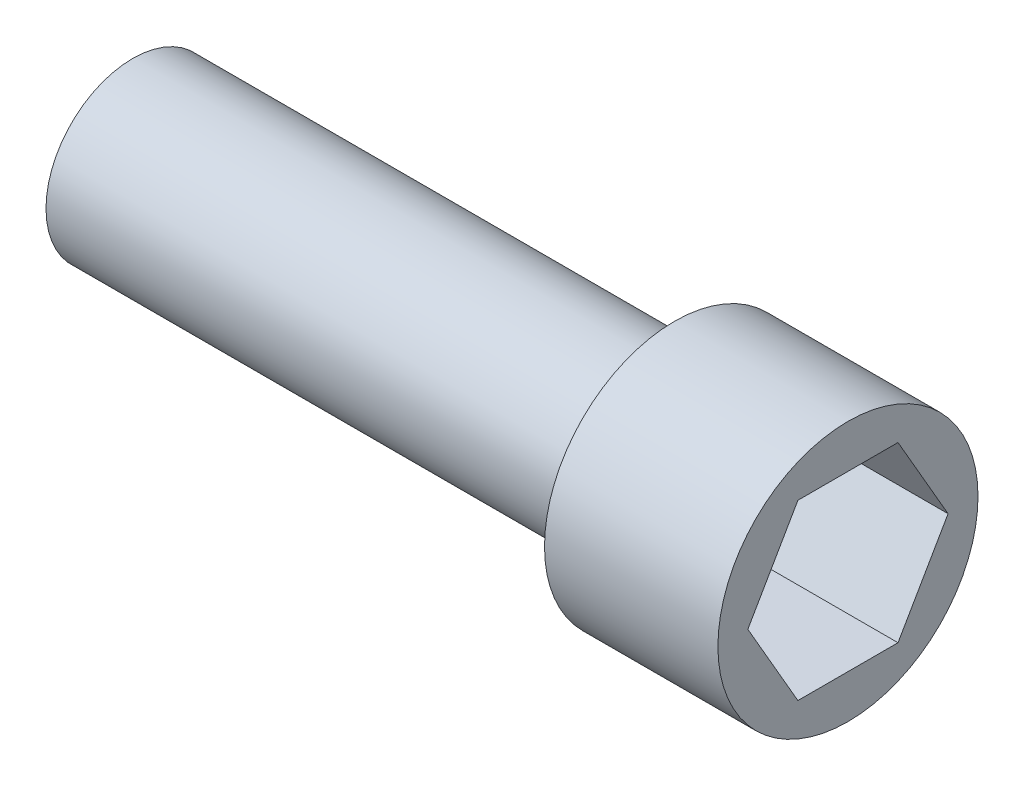
ISO-10303-21;
HEADER;
FILE_DESCRIPTION(('STEP AP214'),'2;1');
FILE_NAME('part.step','',(''),(''),'','','');
FILE_SCHEMA(('AUTOMOTIVE_DESIGN { 1 0 10303 214 1 1 1 1 }'));
ENDSEC;
DATA;
#1=APPLICATION_CONTEXT('core data for automotive mechanical design processes');
#2=APPLICATION_PROTOCOL_DEFINITION('international standard','automotive_design',2000,#1);
#3=PRODUCT_CONTEXT('',#1,'mechanical');
#4=PRODUCT('Part','Part','',(#3));
#5=PRODUCT_RELATED_PRODUCT_CATEGORY('part','',(#4));
#6=PRODUCT_DEFINITION_FORMATION('','',#4);
#7=PRODUCT_DEFINITION_CONTEXT('part definition',#1,'design');
#8=PRODUCT_DEFINITION('design','',#6,#7);
#9=PRODUCT_DEFINITION_SHAPE('','',#8);
#10=(LENGTH_UNIT() NAMED_UNIT(*) SI_UNIT(.MILLI.,.METRE.));
#11=(NAMED_UNIT(*) PLANE_ANGLE_UNIT() SI_UNIT($,.RADIAN.));
#12=(NAMED_UNIT(*) SI_UNIT($,.STERADIAN.) SOLID_ANGLE_UNIT());
#13=UNCERTAINTY_MEASURE_WITH_UNIT(LENGTH_MEASURE(1.E-05),#10,'distance_accuracy_value','');
#14=(GEOMETRIC_REPRESENTATION_CONTEXT(3) GLOBAL_UNCERTAINTY_ASSIGNED_CONTEXT((#13)) GLOBAL_UNIT_ASSIGNED_CONTEXT((#10,
#11,#12)) REPRESENTATION_CONTEXT('',''));
#15=CARTESIAN_POINT('',(0.,0.,0.));
#16=DIRECTION('',(0.,0.,1.));
#17=DIRECTION('',(1.,0.,0.));
#18=AXIS2_PLACEMENT_3D('',#15,#16,#17);
#19=CARTESIAN_POINT('',(0.,0.,0.));
#20=DIRECTION('',(-1.,0.,0.));
#21=DIRECTION('',(0.,0.,1.));
#22=AXIS2_PLACEMENT_3D('',#19,#20,#21);
#23=PLANE('',#22);
#24=CARTESIAN_POINT('',(0.,0.,0.));
#25=DIRECTION('',(1.,0.,0.));
#26=DIRECTION('',(0.,0.,-1.));
#27=AXIS2_PLACEMENT_3D('',#24,#25,#26);
#28=CIRCLE('',#27,4.);
#29=CARTESIAN_POINT('',(0.,0.,-4.));
#30=VERTEX_POINT('',#29);
#31=EDGE_CURVE('E11',#30,#30,#28,.T.);
#32=ORIENTED_EDGE('',*,*,#31,.F.);
#33=EDGE_LOOP('',(#32));
#34=FACE_BOUND('',#33,.T.);
#35=ADVANCED_FACE('F41',(#34),#23,.T.);
#36=CARTESIAN_POINT('',(33.,0.,0.));
#37=DIRECTION('',(1.,0.,0.));
#38=DIRECTION('',(0.,0.,-1.));
#39=AXIS2_PLACEMENT_3D('',#36,#37,#38);
#40=CYLINDRICAL_SURFACE('',#39,4.);
#41=ORIENTED_EDGE('',*,*,#31,.T.);
#42=EDGE_LOOP('',(#41));
#43=FACE_BOUND('',#42,.T.);
#44=CARTESIAN_POINT('',(25.,0.,0.));
#45=DIRECTION('',(1.,0.,0.));
#46=DIRECTION('',(0.,0.,-1.));
#47=AXIS2_PLACEMENT_3D('',#44,#45,#46);
#48=CIRCLE('',#47,4.);
#49=CARTESIAN_POINT('',(25.,0.,-4.));
#50=VERTEX_POINT('',#49);
#51=EDGE_CURVE('E48',#50,#50,#48,.T.);
#52=ORIENTED_EDGE('',*,*,#51,.F.);
#53=EDGE_LOOP('',(#52));
#54=FACE_BOUND('',#53,.T.);
#55=ADVANCED_FACE('F156',(#43,#54),#40,.T.);
#56=CARTESIAN_POINT('',(25.,4.,0.));
#57=DIRECTION('',(-1.,0.,0.));
#58=DIRECTION('',(0.,0.,1.));
#59=AXIS2_PLACEMENT_3D('',#56,#57,#58);
#60=PLANE('',#59);
#61=ORIENTED_EDGE('',*,*,#51,.T.);
#62=EDGE_LOOP('',(#61));
#63=FACE_BOUND('',#62,.T.);
#64=CARTESIAN_POINT('',(25.,0.,0.));
#65=DIRECTION('',(1.,0.,0.));
#66=DIRECTION('',(0.,0.,-1.));
#67=AXIS2_PLACEMENT_3D('',#64,#65,#66);
#68=CIRCLE('',#67,6.);
#69=CARTESIAN_POINT('',(25.,0.,-6.));
#70=VERTEX_POINT('',#69);
#71=EDGE_CURVE('E148',#70,#70,#68,.T.);
#72=ORIENTED_EDGE('',*,*,#71,.F.);
#73=EDGE_LOOP('',(#72));
#74=FACE_BOUND('',#73,.T.);
#75=ADVANCED_FACE('F154',(#63,#74),#60,.T.);
#76=CARTESIAN_POINT('',(33.,0.,0.));
#77=DIRECTION('',(1.,0.,0.));
#78=DIRECTION('',(0.,0.,-1.));
#79=AXIS2_PLACEMENT_3D('',#76,#77,#78);
#80=CYLINDRICAL_SURFACE('',#79,6.);
#81=ORIENTED_EDGE('',*,*,#71,.T.);
#82=EDGE_LOOP('',(#81));
#83=FACE_BOUND('',#82,.T.);
#84=CARTESIAN_POINT('',(33.,0.,0.));
#85=DIRECTION('',(1.,0.,0.));
#86=DIRECTION('',(0.,0.,-1.));
#87=AXIS2_PLACEMENT_3D('',#84,#85,#86);
#88=CIRCLE('',#87,6.);
#89=CARTESIAN_POINT('',(33.,0.,-6.));
#90=VERTEX_POINT('',#89);
#91=EDGE_CURVE('E145',#90,#90,#88,.T.);
#92=ORIENTED_EDGE('',*,*,#91,.F.);
#93=EDGE_LOOP('',(#92));
#94=FACE_BOUND('',#93,.T.);
#95=ADVANCED_FACE('F164',(#83,#94),#80,.T.);
#96=CARTESIAN_POINT('',(33.,6.,0.));
#97=DIRECTION('',(1.,0.,0.));
#98=DIRECTION('',(0.,0.,-1.));
#99=AXIS2_PLACEMENT_3D('',#96,#97,#98);
#100=PLANE('',#99);
#101=DIRECTION('',(0.,0.866025403784439,-0.5));
#102=VECTOR('',#101,1.);
#103=CARTESIAN_POINT('',(33.,-4.,-2.3094010767585));
#104=LINE('',#103,#102);
#105=CARTESIAN_POINT('',(33.,-4.,-2.3094010767585));
#106=VERTEX_POINT('',#105);
#107=CARTESIAN_POINT('',(33.,0.,-4.618802153517));
#108=VERTEX_POINT('',#107);
#109=EDGE_CURVE('E54',#106,#108,#104,.T.);
#110=ORIENTED_EDGE('',*,*,#109,.F.);
#111=DIRECTION('',(0.,0.,-1.));
#112=VECTOR('',#111,1.);
#113=CARTESIAN_POINT('',(33.,-4.,2.3094010767585));
#114=LINE('',#113,#112);
#115=CARTESIAN_POINT('',(33.,-4.,2.3094010767585));
#116=VERTEX_POINT('',#115);
#117=EDGE_CURVE('E138',#116,#106,#114,.T.);
#118=ORIENTED_EDGE('',*,*,#117,.F.);
#119=DIRECTION('',(0.,-0.866025403784438,-0.5));
#120=VECTOR('',#119,1.);
#121=CARTESIAN_POINT('',(33.,0.,4.61880215351701));
#122=LINE('',#121,#120);
#123=CARTESIAN_POINT('',(33.,0.,4.61880215351701));
#124=VERTEX_POINT('',#123);
#125=EDGE_CURVE('E136',#124,#116,#122,.T.);
#126=ORIENTED_EDGE('',*,*,#125,.F.);
#127=DIRECTION('',(0.,-0.866025403784439,0.5));
#128=VECTOR('',#127,1.);
#129=CARTESIAN_POINT('',(33.,4.,2.3094010767585));
#130=LINE('',#129,#128);
#131=CARTESIAN_POINT('',(33.,4.,2.3094010767585));
#132=VERTEX_POINT('',#131);
#133=EDGE_CURVE('E104',#132,#124,#130,.T.);
#134=ORIENTED_EDGE('',*,*,#133,.F.);
#135=DIRECTION('',(0.,0.,1.));
#136=VECTOR('',#135,1.);
#137=CARTESIAN_POINT('',(33.,4.,-2.3094010767585));
#138=LINE('',#137,#136);
#139=CARTESIAN_POINT('',(33.,4.,-2.3094010767585));
#140=VERTEX_POINT('',#139);
#141=EDGE_CURVE('E135',#140,#132,#138,.T.);
#142=ORIENTED_EDGE('',*,*,#141,.F.);
#143=DIRECTION('',(0.,0.866025403784439,0.5));
#144=VECTOR('',#143,1.);
#145=CARTESIAN_POINT('',(33.,0.,-4.618802153517));
#146=LINE('',#145,#144);
#147=EDGE_CURVE('E129',#108,#140,#146,.T.);
#148=ORIENTED_EDGE('',*,*,#147,.F.);
#149=EDGE_LOOP('',(#110,#118,#126,#134,#142,#148));
#150=FACE_BOUND('',#149,.T.);
#151=ORIENTED_EDGE('',*,*,#91,.T.);
#152=EDGE_LOOP('',(#151));
#153=FACE_BOUND('',#152,.T.);
#154=ADVANCED_FACE('F173',(#150,#153),#100,.T.);
#155=CARTESIAN_POINT('',(27.,-4.,-2.3094010767585));
#156=DIRECTION('',(0.,-0.5,-0.866025403784439));
#157=DIRECTION('',(0.,0.866025403784439,-0.5));
#158=AXIS2_PLACEMENT_3D('',#155,#156,#157);
#159=PLANE('',#158);
#160=ORIENTED_EDGE('',*,*,#109,.T.);
#161=DIRECTION('',(1.,0.,0.));
#162=VECTOR('',#161,1.);
#163=CARTESIAN_POINT('',(27.,0.,-4.618802153517));
#164=LINE('',#163,#162);
#165=CARTESIAN_POINT('',(27.,0.,-4.618802153517));
#166=VERTEX_POINT('',#165);
#167=EDGE_CURVE('E82',#166,#108,#164,.T.);
#168=ORIENTED_EDGE('',*,*,#167,.F.);
#169=DIRECTION('',(0.,0.866025403784439,-0.5));
#170=VECTOR('',#169,1.);
#171=CARTESIAN_POINT('',(27.,-4.,-2.3094010767585));
#172=LINE('',#171,#170);
#173=CARTESIAN_POINT('',(27.,-4.,-2.3094010767585));
#174=VERTEX_POINT('',#173);
#175=EDGE_CURVE('E139',#174,#166,#172,.T.);
#176=ORIENTED_EDGE('',*,*,#175,.F.);
#177=DIRECTION('',(1.,0.,0.));
#178=VECTOR('',#177,1.);
#179=CARTESIAN_POINT('',(27.,-4.,-2.3094010767585));
#180=LINE('',#179,#178);
#181=EDGE_CURVE('E61',#174,#106,#180,.T.);
#182=ORIENTED_EDGE('',*,*,#181,.T.);
#183=EDGE_LOOP('',(#160,#168,#176,#182));
#184=FACE_BOUND('',#183,.T.);
#185=ADVANCED_FACE('F172',(#184),#159,.F.);
#186=CARTESIAN_POINT('',(27.,-4.,2.3094010767585));
#187=DIRECTION('',(0.,-1.,0.));
#188=DIRECTION('',(0.,0.,-1.));
#189=AXIS2_PLACEMENT_3D('',#186,#187,#188);
#190=PLANE('',#189);
#191=ORIENTED_EDGE('',*,*,#117,.T.);
#192=ORIENTED_EDGE('',*,*,#181,.F.);
#193=DIRECTION('',(0.,0.,-1.));
#194=VECTOR('',#193,1.);
#195=CARTESIAN_POINT('',(27.,-4.,2.3094010767585));
#196=LINE('',#195,#194);
#197=CARTESIAN_POINT('',(27.,-4.,2.3094010767585));
#198=VERTEX_POINT('',#197);
#199=EDGE_CURVE('E113',#198,#174,#196,.T.);
#200=ORIENTED_EDGE('',*,*,#199,.F.);
#201=DIRECTION('',(1.,0.,0.));
#202=VECTOR('',#201,1.);
#203=CARTESIAN_POINT('',(27.,-4.,2.3094010767585));
#204=LINE('',#203,#202);
#205=EDGE_CURVE('E110',#198,#116,#204,.T.);
#206=ORIENTED_EDGE('',*,*,#205,.T.);
#207=EDGE_LOOP('',(#191,#192,#200,#206));
#208=FACE_BOUND('',#207,.T.);
#209=ADVANCED_FACE('F177',(#208),#190,.F.);
#210=CARTESIAN_POINT('',(27.,0.,4.61880215351701));
#211=DIRECTION('',(0.,-0.5,0.866025403784439));
#212=DIRECTION('',(0.,-0.866025403784439,-0.5));
#213=AXIS2_PLACEMENT_3D('',#210,#211,#212);
#214=PLANE('',#213);
#215=ORIENTED_EDGE('',*,*,#125,.T.);
#216=ORIENTED_EDGE('',*,*,#205,.F.);
#217=DIRECTION('',(0.,-0.866025403784438,-0.5));
#218=VECTOR('',#217,1.);
#219=CARTESIAN_POINT('',(27.,0.,4.61880215351701));
#220=LINE('',#219,#218);
#221=CARTESIAN_POINT('',(27.,0.,4.61880215351701));
#222=VERTEX_POINT('',#221);
#223=EDGE_CURVE('E112',#222,#198,#220,.T.);
#224=ORIENTED_EDGE('',*,*,#223,.F.);
#225=DIRECTION('',(1.,0.,0.));
#226=VECTOR('',#225,1.);
#227=CARTESIAN_POINT('',(27.,0.,4.61880215351701));
#228=LINE('',#227,#226);
#229=EDGE_CURVE('E96',#222,#124,#228,.T.);
#230=ORIENTED_EDGE('',*,*,#229,.T.);
#231=EDGE_LOOP('',(#215,#216,#224,#230));
#232=FACE_BOUND('',#231,.T.);
#233=ADVANCED_FACE('F115',(#232),#214,.F.);
#234=CARTESIAN_POINT('',(27.,4.,2.3094010767585));
#235=DIRECTION('',(0.,0.5,0.866025403784438));
#236=DIRECTION('',(0.,-0.866025403784439,0.5));
#237=AXIS2_PLACEMENT_3D('',#234,#235,#236);
#238=PLANE('',#237);
#239=ORIENTED_EDGE('',*,*,#133,.T.);
#240=ORIENTED_EDGE('',*,*,#229,.F.);
#241=DIRECTION('',(0.,-0.866025403784439,0.5));
#242=VECTOR('',#241,1.);
#243=CARTESIAN_POINT('',(27.,4.,2.3094010767585));
#244=LINE('',#243,#242);
#245=CARTESIAN_POINT('',(27.,4.,2.3094010767585));
#246=VERTEX_POINT('',#245);
#247=EDGE_CURVE('E99',#246,#222,#244,.T.);
#248=ORIENTED_EDGE('',*,*,#247,.F.);
#249=DIRECTION('',(1.,0.,0.));
#250=VECTOR('',#249,1.);
#251=CARTESIAN_POINT('',(27.,4.,2.3094010767585));
#252=LINE('',#251,#250);
#253=EDGE_CURVE('E106',#246,#132,#252,.T.);
#254=ORIENTED_EDGE('',*,*,#253,.T.);
#255=EDGE_LOOP('',(#239,#240,#248,#254));
#256=FACE_BOUND('',#255,.T.);
#257=ADVANCED_FACE('F97',(#256),#238,.F.);
#258=CARTESIAN_POINT('',(27.,4.,-2.3094010767585));
#259=DIRECTION('',(0.,1.,0.));
#260=DIRECTION('',(0.,0.,1.));
#261=AXIS2_PLACEMENT_3D('',#258,#259,#260);
#262=PLANE('',#261);
#263=ORIENTED_EDGE('',*,*,#141,.T.);
#264=ORIENTED_EDGE('',*,*,#253,.F.);
#265=DIRECTION('',(0.,0.,1.));
#266=VECTOR('',#265,1.);
#267=CARTESIAN_POINT('',(27.,4.,-2.3094010767585));
#268=LINE('',#267,#266);
#269=CARTESIAN_POINT('',(27.,4.,-2.3094010767585));
#270=VERTEX_POINT('',#269);
#271=EDGE_CURVE('E123',#270,#246,#268,.T.);
#272=ORIENTED_EDGE('',*,*,#271,.F.);
#273=DIRECTION('',(1.,0.,0.));
#274=VECTOR('',#273,1.);
#275=CARTESIAN_POINT('',(27.,4.,-2.3094010767585));
#276=LINE('',#275,#274);
#277=EDGE_CURVE('E144',#270,#140,#276,.T.);
#278=ORIENTED_EDGE('',*,*,#277,.T.);
#279=EDGE_LOOP('',(#263,#264,#272,#278));
#280=FACE_BOUND('',#279,.T.);
#281=ADVANCED_FACE('F183',(#280),#262,.F.);
#282=CARTESIAN_POINT('',(27.,0.,-4.618802153517));
#283=DIRECTION('',(0.,0.5,-0.866025403784439));
#284=DIRECTION('',(0.,0.866025403784439,0.5));
#285=AXIS2_PLACEMENT_3D('',#282,#283,#284);
#286=PLANE('',#285);
#287=ORIENTED_EDGE('',*,*,#147,.T.);
#288=ORIENTED_EDGE('',*,*,#277,.F.);
#289=DIRECTION('',(0.,0.866025403784439,0.5));
#290=VECTOR('',#289,1.);
#291=CARTESIAN_POINT('',(27.,0.,-4.618802153517));
#292=LINE('',#291,#290);
#293=EDGE_CURVE('E121',#166,#270,#292,.T.);
#294=ORIENTED_EDGE('',*,*,#293,.F.);
#295=ORIENTED_EDGE('',*,*,#167,.T.);
#296=EDGE_LOOP('',(#287,#288,#294,#295));
#297=FACE_BOUND('',#296,.T.);
#298=ADVANCED_FACE('F179',(#297),#286,.F.);
#299=CARTESIAN_POINT('',(27.,0.,0.));
#300=DIRECTION('',(1.,0.,0.));
#301=DIRECTION('',(0.,0.,-1.));
#302=AXIS2_PLACEMENT_3D('',#299,#300,#301);
#303=PLANE('',#302);
#304=ORIENTED_EDGE('',*,*,#175,.T.);
#305=ORIENTED_EDGE('',*,*,#293,.T.);
#306=ORIENTED_EDGE('',*,*,#271,.T.);
#307=ORIENTED_EDGE('',*,*,#247,.T.);
#308=ORIENTED_EDGE('',*,*,#223,.T.);
#309=ORIENTED_EDGE('',*,*,#199,.T.);
#310=EDGE_LOOP('',(#304,#305,#306,#307,#308,#309));
#311=FACE_BOUND('',#310,.T.);
#312=ADVANCED_FACE('F116',(#311),#303,.T.);
#313=CLOSED_SHELL('',(#35,#55,#75,#95,#154,#185,#209,#233,#257,#281,#298,#312));
#314=MANIFOLD_SOLID_BREP('B2',#313);
#315=ADVANCED_BREP_SHAPE_REPRESENTATION('',(#18,#314),#14);
#316=SHAPE_DEFINITION_REPRESENTATION(#9,#315);
ENDSEC;
END-ISO-10303-21;
